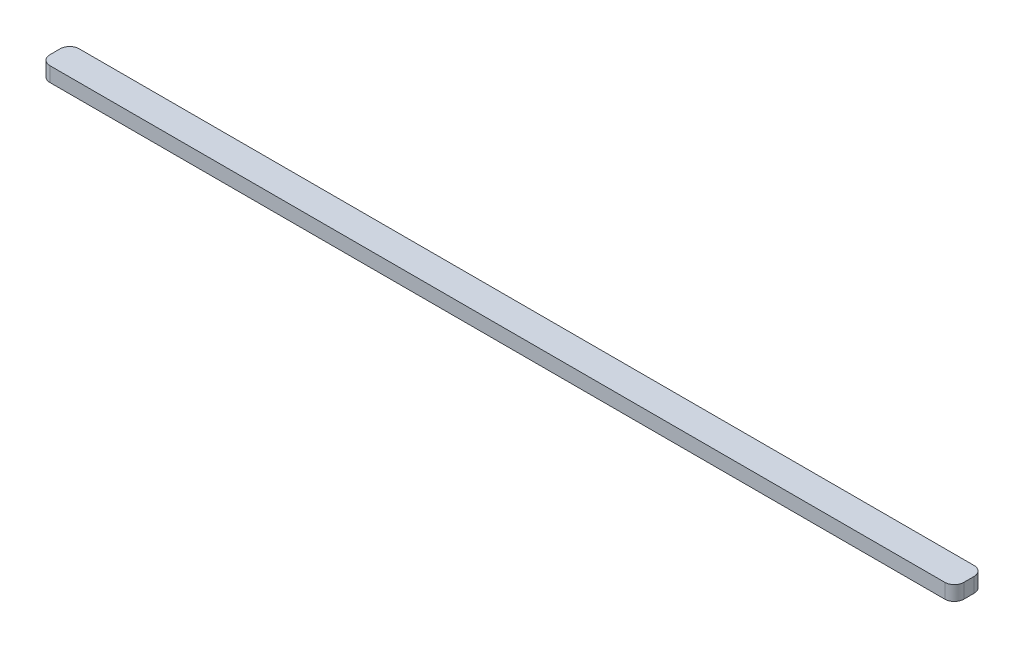
ISO-10303-21;
HEADER;
FILE_DESCRIPTION(('STEP AP214'),'2;1');
FILE_NAME('part.step','',(''),(''),'','','');
FILE_SCHEMA(('AUTOMOTIVE_DESIGN { 1 0 10303 214 1 1 1 1 }'));
ENDSEC;
DATA;
#1=APPLICATION_CONTEXT('core data for automotive mechanical design processes');
#2=APPLICATION_PROTOCOL_DEFINITION('international standard','automotive_design',2000,#1);
#3=PRODUCT_CONTEXT('',#1,'mechanical');
#4=PRODUCT('Part','Part','',(#3));
#5=PRODUCT_RELATED_PRODUCT_CATEGORY('part','',(#4));
#6=PRODUCT_DEFINITION_FORMATION('','',#4);
#7=PRODUCT_DEFINITION_CONTEXT('part definition',#1,'design');
#8=PRODUCT_DEFINITION('design','',#6,#7);
#9=PRODUCT_DEFINITION_SHAPE('','',#8);
#10=(LENGTH_UNIT() NAMED_UNIT(*) SI_UNIT(.MILLI.,.METRE.));
#11=(NAMED_UNIT(*) PLANE_ANGLE_UNIT() SI_UNIT($,.RADIAN.));
#12=(NAMED_UNIT(*) SI_UNIT($,.STERADIAN.) SOLID_ANGLE_UNIT());
#13=UNCERTAINTY_MEASURE_WITH_UNIT(LENGTH_MEASURE(1.E-05),#10,'distance_accuracy_value','');
#14=(GEOMETRIC_REPRESENTATION_CONTEXT(3) GLOBAL_UNCERTAINTY_ASSIGNED_CONTEXT((#13)) GLOBAL_UNIT_ASSIGNED_CONTEXT((#10,
#11,#12)) REPRESENTATION_CONTEXT('',''));
#15=CARTESIAN_POINT('',(0.,0.,0.));
#16=DIRECTION('',(0.,0.,1.));
#17=DIRECTION('',(1.,0.,0.));
#18=AXIS2_PLACEMENT_3D('',#15,#16,#17);
#19=CARTESIAN_POINT('',(61.2,2.,-2.7));
#20=DIRECTION('',(0.,-1.,0.));
#21=DIRECTION('',(0.,0.,-1.));
#22=AXIS2_PLACEMENT_3D('',#19,#20,#21);
#23=CYLINDRICAL_SURFACE('',#22,1.30000000000001);
#24=CARTESIAN_POINT('',(61.2,0.,-2.7));
#25=DIRECTION('',(0.,1.,0.));
#26=DIRECTION('',(0.,0.,1.));
#27=AXIS2_PLACEMENT_3D('',#24,#25,#26);
#28=CIRCLE('',#27,1.30000000000001);
#29=CARTESIAN_POINT('',(62.5,0.,-2.7));
#30=VERTEX_POINT('',#29);
#31=CARTESIAN_POINT('',(61.2,0.,-4.00000000000002));
#32=VERTEX_POINT('',#31);
#33=EDGE_CURVE('E140',#30,#32,#28,.T.);
#34=ORIENTED_EDGE('',*,*,#33,.T.);
#35=DIRECTION('',(0.,-1.,0.));
#36=VECTOR('',#35,1.);
#37=CARTESIAN_POINT('',(61.2,2.,-4.00000000000002));
#38=LINE('',#37,#36);
#39=CARTESIAN_POINT('',(61.2,2.,-4.00000000000002));
#40=VERTEX_POINT('',#39);
#41=EDGE_CURVE('E11',#40,#32,#38,.T.);
#42=ORIENTED_EDGE('',*,*,#41,.F.);
#43=CARTESIAN_POINT('',(61.2,2.,-2.7));
#44=DIRECTION('',(0.,1.,0.));
#45=DIRECTION('',(0.,0.,1.));
#46=AXIS2_PLACEMENT_3D('',#43,#44,#45);
#47=CIRCLE('',#46,1.30000000000001);
#48=CARTESIAN_POINT('',(62.5,2.,-2.7));
#49=VERTEX_POINT('',#48);
#50=EDGE_CURVE('E162',#49,#40,#47,.T.);
#51=ORIENTED_EDGE('',*,*,#50,.F.);
#52=DIRECTION('',(0.,-1.,0.));
#53=VECTOR('',#52,1.);
#54=CARTESIAN_POINT('',(62.5,2.,-2.7));
#55=LINE('',#54,#53);
#56=EDGE_CURVE('E136',#49,#30,#55,.T.);
#57=ORIENTED_EDGE('',*,*,#56,.T.);
#58=EDGE_LOOP('',(#34,#42,#51,#57));
#59=FACE_BOUND('',#58,.T.);
#60=ADVANCED_FACE('F39',(#59),#23,.T.);
#61=CARTESIAN_POINT('',(-61.2,2.,-4.));
#62=DIRECTION('',(0.,0.,1.));
#63=DIRECTION('',(1.,0.,0.));
#64=AXIS2_PLACEMENT_3D('',#61,#62,#63);
#65=PLANE('',#64);
#66=DIRECTION('',(-1.,0.,0.));
#67=VECTOR('',#66,1.);
#68=CARTESIAN_POINT('',(-61.2,0.,-4.));
#69=LINE('',#68,#67);
#70=CARTESIAN_POINT('',(-61.2,0.,-3.99999999999999));
#71=VERTEX_POINT('',#70);
#72=EDGE_CURVE('E144',#32,#71,#69,.T.);
#73=ORIENTED_EDGE('',*,*,#72,.T.);
#74=DIRECTION('',(0.,-1.,0.));
#75=VECTOR('',#74,1.);
#76=CARTESIAN_POINT('',(-61.2,2.,-3.99999999999999));
#77=LINE('',#76,#75);
#78=CARTESIAN_POINT('',(-61.2,2.,-3.99999999999999));
#79=VERTEX_POINT('',#78);
#80=EDGE_CURVE('E48',#79,#71,#77,.T.);
#81=ORIENTED_EDGE('',*,*,#80,.F.);
#82=DIRECTION('',(-1.,0.,0.));
#83=VECTOR('',#82,1.);
#84=CARTESIAN_POINT('',(-61.2,2.,-4.));
#85=LINE('',#84,#83);
#86=EDGE_CURVE('E99',#40,#79,#85,.T.);
#87=ORIENTED_EDGE('',*,*,#86,.F.);
#88=ORIENTED_EDGE('',*,*,#41,.T.);
#89=EDGE_LOOP('',(#73,#81,#87,#88));
#90=FACE_BOUND('',#89,.T.);
#91=ADVANCED_FACE('F208',(#90),#65,.F.);
#92=CARTESIAN_POINT('',(-61.2,2.,-2.69999999999998));
#93=DIRECTION('',(0.,-1.,0.));
#94=DIRECTION('',(0.,0.,-1.));
#95=AXIS2_PLACEMENT_3D('',#92,#93,#94);
#96=CYLINDRICAL_SURFACE('',#95,1.30000000000001);
#97=CARTESIAN_POINT('',(-61.2,0.,-2.69999999999998));
#98=DIRECTION('',(0.,1.,0.));
#99=DIRECTION('',(0.,0.,-1.));
#100=AXIS2_PLACEMENT_3D('',#97,#98,#99);
#101=CIRCLE('',#100,1.30000000000001);
#102=CARTESIAN_POINT('',(-62.5,0.,-2.69999999999998));
#103=VERTEX_POINT('',#102);
#104=EDGE_CURVE('E147',#71,#103,#101,.T.);
#105=ORIENTED_EDGE('',*,*,#104,.T.);
#106=DIRECTION('',(0.,-1.,0.));
#107=VECTOR('',#106,1.);
#108=CARTESIAN_POINT('',(-62.5,2.,-2.69999999999998));
#109=LINE('',#108,#107);
#110=CARTESIAN_POINT('',(-62.5,2.,-2.69999999999998));
#111=VERTEX_POINT('',#110);
#112=EDGE_CURVE('E173',#111,#103,#109,.T.);
#113=ORIENTED_EDGE('',*,*,#112,.F.);
#114=CARTESIAN_POINT('',(-61.2,2.,-2.69999999999998));
#115=DIRECTION('',(0.,1.,0.));
#116=DIRECTION('',(0.,0.,-1.));
#117=AXIS2_PLACEMENT_3D('',#114,#115,#116);
#118=CIRCLE('',#117,1.30000000000001);
#119=EDGE_CURVE('E183',#79,#111,#118,.T.);
#120=ORIENTED_EDGE('',*,*,#119,.F.);
#121=ORIENTED_EDGE('',*,*,#80,.T.);
#122=EDGE_LOOP('',(#105,#113,#120,#121));
#123=FACE_BOUND('',#122,.T.);
#124=ADVANCED_FACE('F181',(#123),#96,.T.);
#125=CARTESIAN_POINT('',(-62.5,2.,-1.3));
#126=DIRECTION('',(1.,0.,0.));
#127=DIRECTION('',(0.,0.,-1.));
#128=AXIS2_PLACEMENT_3D('',#125,#126,#127);
#129=PLANE('',#128);
#130=DIRECTION('',(0.,0.,1.));
#131=VECTOR('',#130,1.);
#132=CARTESIAN_POINT('',(-62.5,0.,-1.3));
#133=LINE('',#132,#131);
#134=CARTESIAN_POINT('',(-62.5,0.,-1.3));
#135=VERTEX_POINT('',#134);
#136=EDGE_CURVE('E150',#103,#135,#133,.T.);
#137=ORIENTED_EDGE('',*,*,#136,.T.);
#138=DIRECTION('',(0.,-1.,0.));
#139=VECTOR('',#138,1.);
#140=CARTESIAN_POINT('',(-62.5,2.,-1.3));
#141=LINE('',#140,#139);
#142=CARTESIAN_POINT('',(-62.5,2.,-1.3));
#143=VERTEX_POINT('',#142);
#144=EDGE_CURVE('E169',#143,#135,#141,.T.);
#145=ORIENTED_EDGE('',*,*,#144,.F.);
#146=DIRECTION('',(0.,0.,1.));
#147=VECTOR('',#146,1.);
#148=CARTESIAN_POINT('',(-62.5,2.,-1.3));
#149=LINE('',#148,#147);
#150=EDGE_CURVE('E196',#111,#143,#149,.T.);
#151=ORIENTED_EDGE('',*,*,#150,.F.);
#152=ORIENTED_EDGE('',*,*,#112,.T.);
#153=EDGE_LOOP('',(#137,#145,#151,#152));
#154=FACE_BOUND('',#153,.T.);
#155=ADVANCED_FACE('F191',(#154),#129,.F.);
#156=CARTESIAN_POINT('',(-61.2,2.,-1.3));
#157=DIRECTION('',(0.,-1.,0.));
#158=DIRECTION('',(0.,0.,-1.));
#159=AXIS2_PLACEMENT_3D('',#156,#157,#158);
#160=CYLINDRICAL_SURFACE('',#159,1.3);
#161=CARTESIAN_POINT('',(-61.2,0.,-1.3));
#162=DIRECTION('',(0.,1.,0.));
#163=DIRECTION('',(0.,0.,1.));
#164=AXIS2_PLACEMENT_3D('',#161,#162,#163);
#165=CIRCLE('',#164,1.3);
#166=CARTESIAN_POINT('',(-61.2,0.,0.));
#167=VERTEX_POINT('',#166);
#168=EDGE_CURVE('E153',#135,#167,#165,.T.);
#169=ORIENTED_EDGE('',*,*,#168,.T.);
#170=DIRECTION('',(0.,-1.,0.));
#171=VECTOR('',#170,1.);
#172=CARTESIAN_POINT('',(-61.2,2.,0.));
#173=LINE('',#172,#171);
#174=CARTESIAN_POINT('',(-61.2,2.,0.));
#175=VERTEX_POINT('',#174);
#176=EDGE_CURVE('E129',#175,#167,#173,.T.);
#177=ORIENTED_EDGE('',*,*,#176,.F.);
#178=CARTESIAN_POINT('',(-61.2,2.,-1.3));
#179=DIRECTION('',(0.,1.,0.));
#180=DIRECTION('',(0.,0.,1.));
#181=AXIS2_PLACEMENT_3D('',#178,#179,#180);
#182=CIRCLE('',#181,1.3);
#183=EDGE_CURVE('E118',#143,#175,#182,.T.);
#184=ORIENTED_EDGE('',*,*,#183,.F.);
#185=ORIENTED_EDGE('',*,*,#144,.T.);
#186=EDGE_LOOP('',(#169,#177,#184,#185));
#187=FACE_BOUND('',#186,.T.);
#188=ADVANCED_FACE('F194',(#187),#160,.T.);
#189=CARTESIAN_POINT('',(-61.2,2.,0.));
#190=DIRECTION('',(0.,0.,-1.));
#191=DIRECTION('',(-1.,0.,0.));
#192=AXIS2_PLACEMENT_3D('',#189,#190,#191);
#193=PLANE('',#192);
#194=DIRECTION('',(1.,0.,0.));
#195=VECTOR('',#194,1.);
#196=CARTESIAN_POINT('',(-61.2,0.,0.));
#197=LINE('',#196,#195);
#198=CARTESIAN_POINT('',(61.2,0.,0.));
#199=VERTEX_POINT('',#198);
#200=EDGE_CURVE('E127',#167,#199,#197,.T.);
#201=ORIENTED_EDGE('',*,*,#200,.T.);
#202=DIRECTION('',(0.,-1.,0.));
#203=VECTOR('',#202,1.);
#204=CARTESIAN_POINT('',(61.2,2.,0.));
#205=LINE('',#204,#203);
#206=CARTESIAN_POINT('',(61.2,2.,0.));
#207=VERTEX_POINT('',#206);
#208=EDGE_CURVE('E124',#207,#199,#205,.T.);
#209=ORIENTED_EDGE('',*,*,#208,.F.);
#210=DIRECTION('',(1.,0.,0.));
#211=VECTOR('',#210,1.);
#212=CARTESIAN_POINT('',(-61.2,2.,0.));
#213=LINE('',#212,#211);
#214=EDGE_CURVE('E112',#175,#207,#213,.T.);
#215=ORIENTED_EDGE('',*,*,#214,.F.);
#216=ORIENTED_EDGE('',*,*,#176,.T.);
#217=EDGE_LOOP('',(#201,#209,#215,#216));
#218=FACE_BOUND('',#217,.T.);
#219=ADVANCED_FACE('F125',(#218),#193,.F.);
#220=CARTESIAN_POINT('',(61.2,2.,-1.30000000000002));
#221=DIRECTION('',(0.,-1.,0.));
#222=DIRECTION('',(0.,0.,-1.));
#223=AXIS2_PLACEMENT_3D('',#220,#221,#222);
#224=CYLINDRICAL_SURFACE('',#223,1.3);
#225=CARTESIAN_POINT('',(61.2,0.,-1.30000000000002));
#226=DIRECTION('',(0.,1.,0.));
#227=DIRECTION('',(0.,0.,-1.));
#228=AXIS2_PLACEMENT_3D('',#225,#226,#227);
#229=CIRCLE('',#228,1.3);
#230=CARTESIAN_POINT('',(62.5,0.,-1.30000000000002));
#231=VERTEX_POINT('',#230);
#232=EDGE_CURVE('E85',#199,#231,#229,.T.);
#233=ORIENTED_EDGE('',*,*,#232,.T.);
#234=DIRECTION('',(0.,-1.,0.));
#235=VECTOR('',#234,1.);
#236=CARTESIAN_POINT('',(62.5,2.,-1.30000000000002));
#237=LINE('',#236,#235);
#238=CARTESIAN_POINT('',(62.5,2.,-1.30000000000002));
#239=VERTEX_POINT('',#238);
#240=EDGE_CURVE('E130',#239,#231,#237,.T.);
#241=ORIENTED_EDGE('',*,*,#240,.F.);
#242=CARTESIAN_POINT('',(61.2,2.,-1.30000000000002));
#243=DIRECTION('',(0.,1.,0.));
#244=DIRECTION('',(0.,0.,-1.));
#245=AXIS2_PLACEMENT_3D('',#242,#243,#244);
#246=CIRCLE('',#245,1.3);
#247=EDGE_CURVE('E116',#207,#239,#246,.T.);
#248=ORIENTED_EDGE('',*,*,#247,.F.);
#249=ORIENTED_EDGE('',*,*,#208,.T.);
#250=EDGE_LOOP('',(#233,#241,#248,#249));
#251=FACE_BOUND('',#250,.T.);
#252=ADVANCED_FACE('F132',(#251),#224,.T.);
#253=CARTESIAN_POINT('',(62.5,2.,-2.7));
#254=DIRECTION('',(-1.,0.,0.));
#255=DIRECTION('',(0.,0.,1.));
#256=AXIS2_PLACEMENT_3D('',#253,#254,#255);
#257=PLANE('',#256);
#258=DIRECTION('',(0.,0.,-1.));
#259=VECTOR('',#258,1.);
#260=CARTESIAN_POINT('',(62.5,0.,-2.7));
#261=LINE('',#260,#259);
#262=EDGE_CURVE('E91',#231,#30,#261,.T.);
#263=ORIENTED_EDGE('',*,*,#262,.T.);
#264=ORIENTED_EDGE('',*,*,#56,.F.);
#265=DIRECTION('',(0.,0.,-1.));
#266=VECTOR('',#265,1.);
#267=CARTESIAN_POINT('',(62.5,2.,-2.7));
#268=LINE('',#267,#266);
#269=EDGE_CURVE('E56',#239,#49,#268,.T.);
#270=ORIENTED_EDGE('',*,*,#269,.F.);
#271=ORIENTED_EDGE('',*,*,#240,.T.);
#272=EDGE_LOOP('',(#263,#264,#270,#271));
#273=FACE_BOUND('',#272,.T.);
#274=ADVANCED_FACE('F224',(#273),#257,.F.);
#275=CARTESIAN_POINT('',(61.2,2.,-2.7));
#276=DIRECTION('',(0.,1.,0.));
#277=DIRECTION('',(0.,0.,1.));
#278=AXIS2_PLACEMENT_3D('',#275,#276,#277);
#279=PLANE('',#278);
#280=ORIENTED_EDGE('',*,*,#50,.T.);
#281=ORIENTED_EDGE('',*,*,#86,.T.);
#282=ORIENTED_EDGE('',*,*,#119,.T.);
#283=ORIENTED_EDGE('',*,*,#150,.T.);
#284=ORIENTED_EDGE('',*,*,#183,.T.);
#285=ORIENTED_EDGE('',*,*,#214,.T.);
#286=ORIENTED_EDGE('',*,*,#247,.T.);
#287=ORIENTED_EDGE('',*,*,#269,.T.);
#288=EDGE_LOOP('',(#280,#281,#282,#283,#284,#285,#286,#287));
#289=FACE_BOUND('',#288,.T.);
#290=ADVANCED_FACE('F114',(#289),#279,.T.);
#291=CARTESIAN_POINT('',(61.2,0.,-2.7));
#292=DIRECTION('',(0.,1.,0.));
#293=DIRECTION('',(0.,0.,1.));
#294=AXIS2_PLACEMENT_3D('',#291,#292,#293);
#295=PLANE('',#294);
#296=ORIENTED_EDGE('',*,*,#33,.F.);
#297=ORIENTED_EDGE('',*,*,#262,.F.);
#298=ORIENTED_EDGE('',*,*,#232,.F.);
#299=ORIENTED_EDGE('',*,*,#200,.F.);
#300=ORIENTED_EDGE('',*,*,#168,.F.);
#301=ORIENTED_EDGE('',*,*,#136,.F.);
#302=ORIENTED_EDGE('',*,*,#104,.F.);
#303=ORIENTED_EDGE('',*,*,#72,.F.);
#304=EDGE_LOOP('',(#296,#297,#298,#299,#300,#301,#302,#303));
#305=FACE_BOUND('',#304,.T.);
#306=ADVANCED_FACE('F187',(#305),#295,.F.);
#307=CLOSED_SHELL('',(#60,#91,#124,#155,#188,#219,#252,#274,#290,#306));
#308=MANIFOLD_SOLID_BREP('B2',#307);
#309=ADVANCED_BREP_SHAPE_REPRESENTATION('',(#18,#308),#14);
#310=SHAPE_DEFINITION_REPRESENTATION(#9,#309);
ENDSEC;
END-ISO-10303-21;
